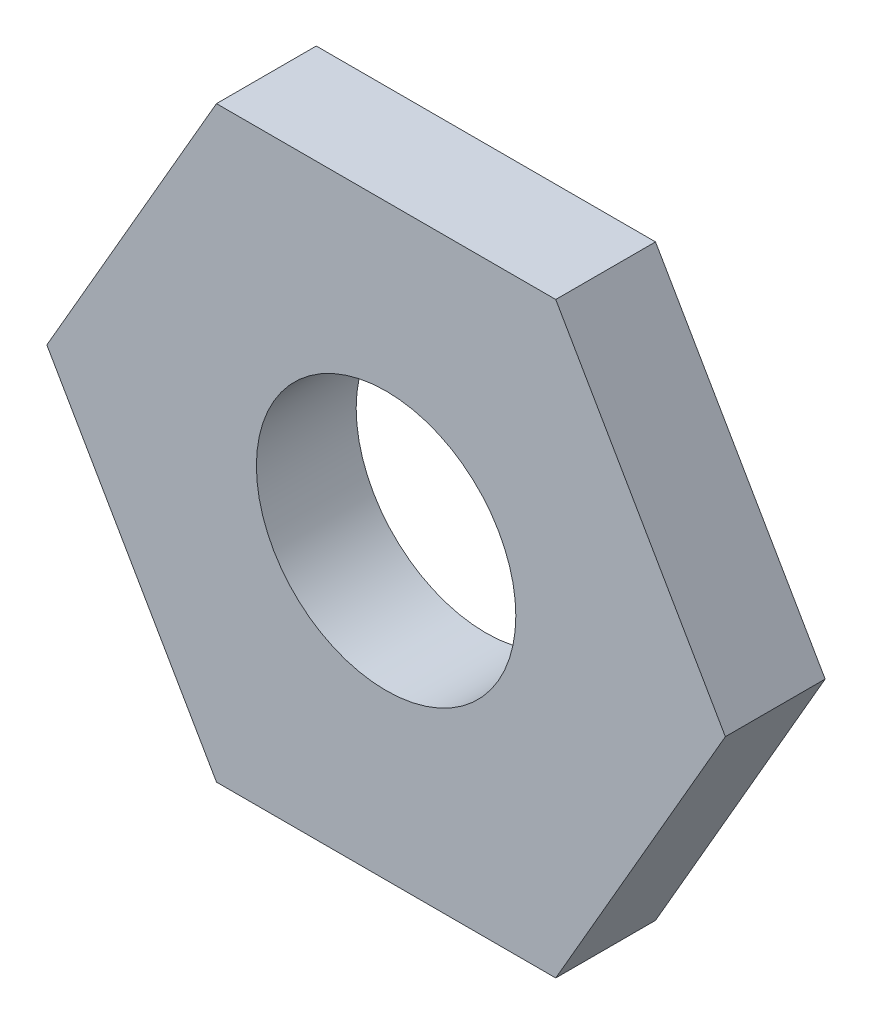
ISO-10303-21;
HEADER;
FILE_DESCRIPTION(('STEP AP214'),'2;1');
FILE_NAME('part.step','',(''),(''),'','','');
FILE_SCHEMA(('AUTOMOTIVE_DESIGN { 1 0 10303 214 1 1 1 1 }'));
ENDSEC;
DATA;
#1=APPLICATION_CONTEXT('core data for automotive mechanical design processes');
#2=APPLICATION_PROTOCOL_DEFINITION('international standard','automotive_design',2000,#1);
#3=PRODUCT_CONTEXT('',#1,'mechanical');
#4=PRODUCT('Part','Part','',(#3));
#5=PRODUCT_RELATED_PRODUCT_CATEGORY('part','',(#4));
#6=PRODUCT_DEFINITION_FORMATION('','',#4);
#7=PRODUCT_DEFINITION_CONTEXT('part definition',#1,'design');
#8=PRODUCT_DEFINITION('design','',#6,#7);
#9=PRODUCT_DEFINITION_SHAPE('','',#8);
#10=(LENGTH_UNIT() NAMED_UNIT(*) SI_UNIT(.MILLI.,.METRE.));
#11=(NAMED_UNIT(*) PLANE_ANGLE_UNIT() SI_UNIT($,.RADIAN.));
#12=(NAMED_UNIT(*) SI_UNIT($,.STERADIAN.) SOLID_ANGLE_UNIT());
#13=UNCERTAINTY_MEASURE_WITH_UNIT(LENGTH_MEASURE(1.E-05),#10,'distance_accuracy_value','');
#14=(GEOMETRIC_REPRESENTATION_CONTEXT(3) GLOBAL_UNCERTAINTY_ASSIGNED_CONTEXT((#13)) GLOBAL_UNIT_ASSIGNED_CONTEXT((#10,
#11,#12)) REPRESENTATION_CONTEXT('',''));
#15=CARTESIAN_POINT('',(0.,0.,0.));
#16=DIRECTION('',(0.,0.,1.));
#17=DIRECTION('',(1.,0.,0.));
#18=AXIS2_PLACEMENT_3D('',#15,#16,#17);
#19=CARTESIAN_POINT('',(8.5,14.7224318643355,5.));
#20=DIRECTION('',(0.,-1.,0.));
#21=DIRECTION('',(0.,0.,-1.));
#22=AXIS2_PLACEMENT_3D('',#19,#20,#21);
#23=PLANE('',#22);
#24=DIRECTION('',(-1.,0.,0.));
#25=VECTOR('',#24,1.);
#26=CARTESIAN_POINT('',(8.5,14.7224318643355,0.));
#27=LINE('',#26,#25);
#28=CARTESIAN_POINT('',(8.5,14.7224318643355,0.));
#29=VERTEX_POINT('',#28);
#30=CARTESIAN_POINT('',(-8.5,14.7224318643355,0.));
#31=VERTEX_POINT('',#30);
#32=EDGE_CURVE('E117',#29,#31,#27,.T.);
#33=ORIENTED_EDGE('',*,*,#32,.T.);
#34=DIRECTION('',(0.,0.,-1.));
#35=VECTOR('',#34,1.);
#36=CARTESIAN_POINT('',(-8.5,14.7224318643355,5.));
#37=LINE('',#36,#35);
#38=CARTESIAN_POINT('',(-8.5,14.7224318643355,5.));
#39=VERTEX_POINT('',#38);
#40=EDGE_CURVE('E11',#39,#31,#37,.T.);
#41=ORIENTED_EDGE('',*,*,#40,.F.);
#42=DIRECTION('',(-1.,0.,0.));
#43=VECTOR('',#42,1.);
#44=CARTESIAN_POINT('',(8.5,14.7224318643355,5.));
#45=LINE('',#44,#43);
#46=CARTESIAN_POINT('',(8.5,14.7224318643355,5.));
#47=VERTEX_POINT('',#46);
#48=EDGE_CURVE('E128',#47,#39,#45,.T.);
#49=ORIENTED_EDGE('',*,*,#48,.F.);
#50=DIRECTION('',(0.,0.,-1.));
#51=VECTOR('',#50,1.);
#52=CARTESIAN_POINT('',(8.5,14.7224318643355,5.));
#53=LINE('',#52,#51);
#54=EDGE_CURVE('E113',#47,#29,#53,.T.);
#55=ORIENTED_EDGE('',*,*,#54,.T.);
#56=EDGE_LOOP('',(#33,#41,#49,#55));
#57=FACE_BOUND('',#56,.T.);
#58=ADVANCED_FACE('F33',(#57),#23,.F.);
#59=CARTESIAN_POINT('',(-8.5,14.7224318643355,5.));
#60=DIRECTION('',(0.866025403784439,-0.5,0.));
#61=DIRECTION('',(0.5,0.866025403784439,0.));
#62=AXIS2_PLACEMENT_3D('',#59,#60,#61);
#63=PLANE('',#62);
#64=DIRECTION('',(-0.5,-0.866025403784439,0.));
#65=VECTOR('',#64,1.);
#66=CARTESIAN_POINT('',(-8.5,14.7224318643355,0.));
#67=LINE('',#66,#65);
#68=CARTESIAN_POINT('',(-17.,0.,0.));
#69=VERTEX_POINT('',#68);
#70=EDGE_CURVE('E120',#31,#69,#67,.T.);
#71=ORIENTED_EDGE('',*,*,#70,.T.);
#72=DIRECTION('',(0.,0.,-1.));
#73=VECTOR('',#72,1.);
#74=CARTESIAN_POINT('',(-17.,0.,5.));
#75=LINE('',#74,#73);
#76=CARTESIAN_POINT('',(-17.,0.,5.));
#77=VERTEX_POINT('',#76);
#78=EDGE_CURVE('E41',#77,#69,#75,.T.);
#79=ORIENTED_EDGE('',*,*,#78,.F.);
#80=DIRECTION('',(-0.5,-0.866025403784439,0.));
#81=VECTOR('',#80,1.);
#82=CARTESIAN_POINT('',(-8.5,14.7224318643355,5.));
#83=LINE('',#82,#81);
#84=EDGE_CURVE('E86',#39,#77,#83,.T.);
#85=ORIENTED_EDGE('',*,*,#84,.F.);
#86=ORIENTED_EDGE('',*,*,#40,.T.);
#87=EDGE_LOOP('',(#71,#79,#85,#86));
#88=FACE_BOUND('',#87,.T.);
#89=ADVANCED_FACE('F153',(#88),#63,.F.);
#90=CARTESIAN_POINT('',(-17.,0.,5.));
#91=DIRECTION('',(0.866025403784438,0.500000000000001,0.));
#92=DIRECTION('',(-0.500000000000001,0.866025403784438,0.));
#93=AXIS2_PLACEMENT_3D('',#90,#91,#92);
#94=PLANE('',#93);
#95=DIRECTION('',(0.500000000000001,-0.866025403784438,0.));
#96=VECTOR('',#95,1.);
#97=CARTESIAN_POINT('',(-17.,0.,0.));
#98=LINE('',#97,#96);
#99=CARTESIAN_POINT('',(-8.49999999999998,-14.7224318643355,0.));
#100=VERTEX_POINT('',#99);
#101=EDGE_CURVE('E123',#69,#100,#98,.T.);
#102=ORIENTED_EDGE('',*,*,#101,.T.);
#103=DIRECTION('',(0.,0.,-1.));
#104=VECTOR('',#103,1.);
#105=CARTESIAN_POINT('',(-8.49999999999998,-14.7224318643355,5.));
#106=LINE('',#105,#104);
#107=CARTESIAN_POINT('',(-8.49999999999998,-14.7224318643355,5.));
#108=VERTEX_POINT('',#107);
#109=EDGE_CURVE('E108',#108,#100,#106,.T.);
#110=ORIENTED_EDGE('',*,*,#109,.F.);
#111=DIRECTION('',(0.500000000000001,-0.866025403784438,0.));
#112=VECTOR('',#111,1.);
#113=CARTESIAN_POINT('',(-17.,0.,5.));
#114=LINE('',#113,#112);
#115=EDGE_CURVE('E99',#77,#108,#114,.T.);
#116=ORIENTED_EDGE('',*,*,#115,.F.);
#117=ORIENTED_EDGE('',*,*,#78,.T.);
#118=EDGE_LOOP('',(#102,#110,#116,#117));
#119=FACE_BOUND('',#118,.T.);
#120=ADVANCED_FACE('F134',(#119),#94,.F.);
#121=CARTESIAN_POINT('',(-8.49999999999998,-14.7224318643355,5.));
#122=DIRECTION('',(0.,1.,0.));
#123=DIRECTION('',(0.,0.,1.));
#124=AXIS2_PLACEMENT_3D('',#121,#122,#123);
#125=PLANE('',#124);
#126=DIRECTION('',(1.,0.,0.));
#127=VECTOR('',#126,1.);
#128=CARTESIAN_POINT('',(-8.49999999999998,-14.7224318643355,0.));
#129=LINE('',#128,#127);
#130=CARTESIAN_POINT('',(8.49999999999999,-14.7224318643355,0.));
#131=VERTEX_POINT('',#130);
#132=EDGE_CURVE('E107',#100,#131,#129,.T.);
#133=ORIENTED_EDGE('',*,*,#132,.T.);
#134=DIRECTION('',(0.,0.,-1.));
#135=VECTOR('',#134,1.);
#136=CARTESIAN_POINT('',(8.49999999999999,-14.7224318643355,5.));
#137=LINE('',#136,#135);
#138=CARTESIAN_POINT('',(8.49999999999999,-14.7224318643355,5.));
#139=VERTEX_POINT('',#138);
#140=EDGE_CURVE('E104',#139,#131,#137,.T.);
#141=ORIENTED_EDGE('',*,*,#140,.F.);
#142=DIRECTION('',(1.,0.,0.));
#143=VECTOR('',#142,1.);
#144=CARTESIAN_POINT('',(-8.49999999999998,-14.7224318643355,5.));
#145=LINE('',#144,#143);
#146=EDGE_CURVE('E93',#108,#139,#145,.T.);
#147=ORIENTED_EDGE('',*,*,#146,.F.);
#148=ORIENTED_EDGE('',*,*,#109,.T.);
#149=EDGE_LOOP('',(#133,#141,#147,#148));
#150=FACE_BOUND('',#149,.T.);
#151=ADVANCED_FACE('F105',(#150),#125,.F.);
#152=CARTESIAN_POINT('',(8.49999999999999,-14.7224318643355,5.));
#153=DIRECTION('',(-0.866025403784438,0.5,0.));
#154=DIRECTION('',(-0.5,-0.866025403784439,0.));
#155=AXIS2_PLACEMENT_3D('',#152,#153,#154);
#156=PLANE('',#155);
#157=DIRECTION('',(0.5,0.866025403784439,0.));
#158=VECTOR('',#157,1.);
#159=CARTESIAN_POINT('',(8.49999999999999,-14.7224318643355,0.));
#160=LINE('',#159,#158);
#161=CARTESIAN_POINT('',(17.,0.,0.));
#162=VERTEX_POINT('',#161);
#163=EDGE_CURVE('E72',#131,#162,#160,.T.);
#164=ORIENTED_EDGE('',*,*,#163,.T.);
#165=DIRECTION('',(0.,0.,-1.));
#166=VECTOR('',#165,1.);
#167=CARTESIAN_POINT('',(17.,0.,5.));
#168=LINE('',#167,#166);
#169=CARTESIAN_POINT('',(17.,0.,5.));
#170=VERTEX_POINT('',#169);
#171=EDGE_CURVE('E109',#170,#162,#168,.T.);
#172=ORIENTED_EDGE('',*,*,#171,.F.);
#173=DIRECTION('',(0.5,0.866025403784439,0.));
#174=VECTOR('',#173,1.);
#175=CARTESIAN_POINT('',(8.49999999999999,-14.7224318643355,5.));
#176=LINE('',#175,#174);
#177=EDGE_CURVE('E97',#139,#170,#176,.T.);
#178=ORIENTED_EDGE('',*,*,#177,.F.);
#179=ORIENTED_EDGE('',*,*,#140,.T.);
#180=EDGE_LOOP('',(#164,#172,#178,#179));
#181=FACE_BOUND('',#180,.T.);
#182=ADVANCED_FACE('F111',(#181),#156,.F.);
#183=CARTESIAN_POINT('',(17.,0.,5.));
#184=DIRECTION('',(-0.866025403784439,-0.5,0.));
#185=DIRECTION('',(0.5,-0.866025403784439,0.));
#186=AXIS2_PLACEMENT_3D('',#183,#184,#185);
#187=PLANE('',#186);
#188=DIRECTION('',(-0.5,0.866025403784439,0.));
#189=VECTOR('',#188,1.);
#190=CARTESIAN_POINT('',(17.,0.,0.));
#191=LINE('',#190,#189);
#192=EDGE_CURVE('E78',#162,#29,#191,.T.);
#193=ORIENTED_EDGE('',*,*,#192,.T.);
#194=ORIENTED_EDGE('',*,*,#54,.F.);
#195=DIRECTION('',(-0.5,0.866025403784439,0.));
#196=VECTOR('',#195,1.);
#197=CARTESIAN_POINT('',(17.,0.,5.));
#198=LINE('',#197,#196);
#199=EDGE_CURVE('E49',#170,#47,#198,.T.);
#200=ORIENTED_EDGE('',*,*,#199,.F.);
#201=ORIENTED_EDGE('',*,*,#171,.T.);
#202=EDGE_LOOP('',(#193,#194,#200,#201));
#203=FACE_BOUND('',#202,.T.);
#204=ADVANCED_FACE('F141',(#203),#187,.F.);
#205=CARTESIAN_POINT('',(0.,0.,5.));
#206=DIRECTION('',(0.,0.,1.));
#207=DIRECTION('',(1.,0.,0.));
#208=AXIS2_PLACEMENT_3D('',#205,#206,#207);
#209=PLANE('',#208);
#210=CARTESIAN_POINT('',(0.,0.,5.));
#211=DIRECTION('',(0.,0.,1.));
#212=DIRECTION('',(1.,0.,0.));
#213=AXIS2_PLACEMENT_3D('',#210,#211,#212);
#214=CIRCLE('',#213,6.5);
#215=CARTESIAN_POINT('',(6.5,0.,5.));
#216=VERTEX_POINT('',#215);
#217=EDGE_CURVE('E208',#216,#216,#214,.T.);
#218=ORIENTED_EDGE('',*,*,#217,.F.);
#219=EDGE_LOOP('',(#218));
#220=FACE_BOUND('',#219,.T.);
#221=ORIENTED_EDGE('',*,*,#48,.T.);
#222=ORIENTED_EDGE('',*,*,#84,.T.);
#223=ORIENTED_EDGE('',*,*,#115,.T.);
#224=ORIENTED_EDGE('',*,*,#146,.T.);
#225=ORIENTED_EDGE('',*,*,#177,.T.);
#226=ORIENTED_EDGE('',*,*,#199,.T.);
#227=EDGE_LOOP('',(#221,#222,#223,#224,#225,#226));
#228=FACE_BOUND('',#227,.T.);
#229=ADVANCED_FACE('F95',(#220,#228),#209,.T.);
#230=CARTESIAN_POINT('',(0.,0.,0.));
#231=DIRECTION('',(0.,0.,1.));
#232=DIRECTION('',(1.,0.,0.));
#233=AXIS2_PLACEMENT_3D('',#230,#231,#232);
#234=PLANE('',#233);
#235=CARTESIAN_POINT('',(0.,0.,0.));
#236=DIRECTION('',(0.,0.,1.));
#237=DIRECTION('',(1.,0.,0.));
#238=AXIS2_PLACEMENT_3D('',#235,#236,#237);
#239=CIRCLE('',#238,6.5);
#240=CARTESIAN_POINT('',(6.5,0.,0.));
#241=VERTEX_POINT('',#240);
#242=EDGE_CURVE('E121',#241,#241,#239,.T.);
#243=ORIENTED_EDGE('',*,*,#242,.T.);
#244=EDGE_LOOP('',(#243));
#245=FACE_BOUND('',#244,.T.);
#246=ORIENTED_EDGE('',*,*,#32,.F.);
#247=ORIENTED_EDGE('',*,*,#192,.F.);
#248=ORIENTED_EDGE('',*,*,#163,.F.);
#249=ORIENTED_EDGE('',*,*,#132,.F.);
#250=ORIENTED_EDGE('',*,*,#101,.F.);
#251=ORIENTED_EDGE('',*,*,#70,.F.);
#252=EDGE_LOOP('',(#246,#247,#248,#249,#250,#251));
#253=FACE_BOUND('',#252,.T.);
#254=ADVANCED_FACE('F137',(#245,#253),#234,.F.);
#255=CARTESIAN_POINT('',(0.,0.,0.));
#256=DIRECTION('',(0.,0.,1.));
#257=DIRECTION('',(1.,0.,0.));
#258=AXIS2_PLACEMENT_3D('',#255,#256,#257);
#259=CYLINDRICAL_SURFACE('',#258,6.5);
#260=ORIENTED_EDGE('',*,*,#242,.F.);
#261=EDGE_LOOP('',(#260));
#262=FACE_BOUND('',#261,.T.);
#263=ORIENTED_EDGE('',*,*,#217,.T.);
#264=EDGE_LOOP('',(#263));
#265=FACE_BOUND('',#264,.T.);
#266=ADVANCED_FACE('F190',(#262,#265),#259,.F.);
#267=CLOSED_SHELL('',(#58,#89,#120,#151,#182,#204,#229,#254,#266));
#268=MANIFOLD_SOLID_BREP('B2',#267);
#269=ADVANCED_BREP_SHAPE_REPRESENTATION('',(#18,#268),#14);
#270=SHAPE_DEFINITION_REPRESENTATION(#9,#269);
ENDSEC;
END-ISO-10303-21;
